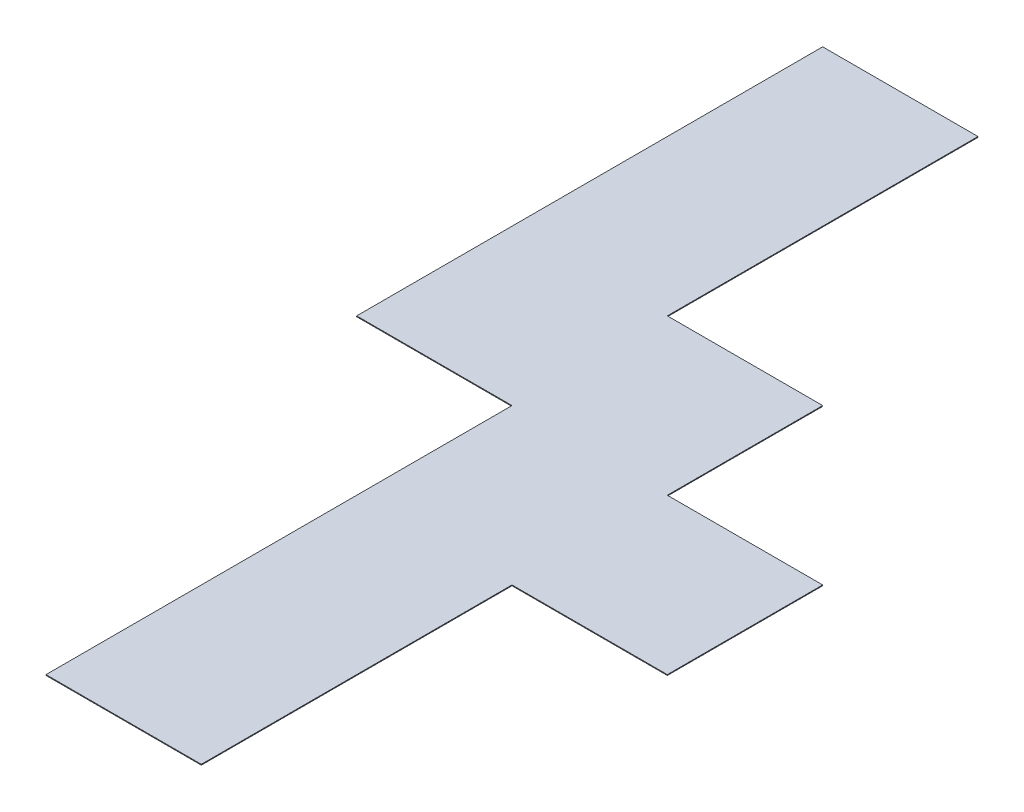
ISO-10303-21;
HEADER;
FILE_DESCRIPTION(('STEP AP214'),'2;1');
FILE_NAME('part.step','',(''),(''),'','','');
FILE_SCHEMA(('AUTOMOTIVE_DESIGN { 1 0 10303 214 1 1 1 1 }'));
ENDSEC;
DATA;
#1=APPLICATION_CONTEXT('core data for automotive mechanical design processes');
#2=APPLICATION_PROTOCOL_DEFINITION('international standard','automotive_design',2000,#1);
#3=PRODUCT_CONTEXT('',#1,'mechanical');
#4=PRODUCT('Part','Part','',(#3));
#5=PRODUCT_RELATED_PRODUCT_CATEGORY('part','',(#4));
#6=PRODUCT_DEFINITION_FORMATION('','',#4);
#7=PRODUCT_DEFINITION_CONTEXT('part definition',#1,'design');
#8=PRODUCT_DEFINITION('design','',#6,#7);
#9=PRODUCT_DEFINITION_SHAPE('','',#8);
#10=(LENGTH_UNIT() NAMED_UNIT(*) SI_UNIT(.MILLI.,.METRE.));
#11=(NAMED_UNIT(*) PLANE_ANGLE_UNIT() SI_UNIT($,.RADIAN.));
#12=(NAMED_UNIT(*) SI_UNIT($,.STERADIAN.) SOLID_ANGLE_UNIT());
#13=UNCERTAINTY_MEASURE_WITH_UNIT(LENGTH_MEASURE(1.E-05),#10,'distance_accuracy_value','');
#14=(GEOMETRIC_REPRESENTATION_CONTEXT(3) GLOBAL_UNCERTAINTY_ASSIGNED_CONTEXT((#13)) GLOBAL_UNIT_ASSIGNED_CONTEXT((#10,
#11,#12)) REPRESENTATION_CONTEXT('',''));
#15=CARTESIAN_POINT('',(0.,0.,0.));
#16=DIRECTION('',(0.,0.,1.));
#17=DIRECTION('',(1.,0.,0.));
#18=AXIS2_PLACEMENT_3D('',#15,#16,#17);
#19=CARTESIAN_POINT('',(2.97318429210987,2.601,1.67623709172676E-13));
#20=DIRECTION('',(1.,0.,0.));
#21=DIRECTION('',(0.,0.,-1.));
#22=AXIS2_PLACEMENT_3D('',#19,#20,#21);
#23=PLANE('',#22);
#24=DIRECTION('',(0.,0.,1.));
#25=VECTOR('',#24,1.);
#26=CARTESIAN_POINT('',(2.97318429210987,2.6,1.67623709172676E-13));
#27=LINE('',#26,#25);
#28=CARTESIAN_POINT('',(2.97318429210977,2.6,1.31907068929163));
#29=VERTEX_POINT('',#28);
#30=CARTESIAN_POINT('',(2.97318429210977,2.6,1.71907068929163));
#31=VERTEX_POINT('',#30);
#32=EDGE_CURVE('E11',#29,#31,#27,.T.);
#33=ORIENTED_EDGE('',*,*,#32,.F.);
#34=DIRECTION('',(0.,-1.,0.));
#35=VECTOR('',#34,1.);
#36=CARTESIAN_POINT('',(2.97318429210977,2.601,1.31907068929163));
#37=LINE('',#36,#35);
#38=CARTESIAN_POINT('',(2.97318429210977,2.601,1.31907068929163));
#39=VERTEX_POINT('',#38);
#40=EDGE_CURVE('E24',#39,#29,#37,.T.);
#41=ORIENTED_EDGE('',*,*,#40,.F.);
#42=DIRECTION('',(0.,0.,1.));
#43=VECTOR('',#42,1.);
#44=CARTESIAN_POINT('',(2.97318429210987,2.601,1.67623709172676E-13));
#45=LINE('',#44,#43);
#46=CARTESIAN_POINT('',(2.97318429210977,2.601,1.71907068929163));
#47=VERTEX_POINT('',#46);
#48=EDGE_CURVE('E206',#39,#47,#45,.T.);
#49=ORIENTED_EDGE('',*,*,#48,.T.);
#50=DIRECTION('',(0.,-1.,0.));
#51=VECTOR('',#50,1.);
#52=CARTESIAN_POINT('',(2.97318429210977,2.601,1.71907068929163));
#53=LINE('',#52,#51);
#54=EDGE_CURVE('E126',#47,#31,#53,.T.);
#55=ORIENTED_EDGE('',*,*,#54,.T.);
#56=EDGE_LOOP('',(#33,#41,#49,#55));
#57=FACE_BOUND('',#56,.T.);
#58=ADVANCED_FACE('F17',(#57),#23,.T.);
#59=CARTESIAN_POINT('',(0.,2.601,1.31907068929163));
#60=DIRECTION('',(0.,0.,-1.));
#61=DIRECTION('',(-1.,0.,0.));
#62=AXIS2_PLACEMENT_3D('',#59,#60,#61);
#63=PLANE('',#62);
#64=DIRECTION('',(1.,0.,0.));
#65=VECTOR('',#64,1.);
#66=CARTESIAN_POINT('',(0.,2.6,1.31907068929163));
#67=LINE('',#66,#65);
#68=CARTESIAN_POINT('',(3.17318429210943,2.6,1.31907068929163));
#69=VERTEX_POINT('',#68);
#70=EDGE_CURVE('E203',#29,#69,#67,.T.);
#71=ORIENTED_EDGE('',*,*,#70,.T.);
#72=DIRECTION('',(0.,-1.,0.));
#73=VECTOR('',#72,1.);
#74=CARTESIAN_POINT('',(3.17318429210943,2.601,1.31907068929163));
#75=LINE('',#74,#73);
#76=CARTESIAN_POINT('',(3.17318429210943,2.601,1.31907068929163));
#77=VERTEX_POINT('',#76);
#78=EDGE_CURVE('E200',#77,#69,#75,.T.);
#79=ORIENTED_EDGE('',*,*,#78,.F.);
#80=DIRECTION('',(1.,0.,0.));
#81=VECTOR('',#80,1.);
#82=CARTESIAN_POINT('',(0.,2.601,1.31907068929163));
#83=LINE('',#82,#81);
#84=EDGE_CURVE('E197',#39,#77,#83,.T.);
#85=ORIENTED_EDGE('',*,*,#84,.F.);
#86=ORIENTED_EDGE('',*,*,#40,.T.);
#87=EDGE_LOOP('',(#71,#79,#85,#86));
#88=FACE_BOUND('',#87,.T.);
#89=ADVANCED_FACE('F209',(#88),#63,.F.);
#90=CARTESIAN_POINT('',(3.17318429210951,2.601,1.78899411766505E-13));
#91=DIRECTION('',(1.,0.,0.));
#92=DIRECTION('',(0.,0.,-1.));
#93=AXIS2_PLACEMENT_3D('',#90,#91,#92);
#94=PLANE('',#93);
#95=DIRECTION('',(0.,0.,1.));
#96=VECTOR('',#95,1.);
#97=CARTESIAN_POINT('',(3.17318429210951,2.6,1.78899411766505E-13));
#98=LINE('',#97,#96);
#99=CARTESIAN_POINT('',(3.17318429210943,2.6,1.11907068929163));
#100=VERTEX_POINT('',#99);
#101=EDGE_CURVE('E194',#100,#69,#98,.T.);
#102=ORIENTED_EDGE('',*,*,#101,.F.);
#103=DIRECTION('',(0.,-1.,0.));
#104=VECTOR('',#103,1.);
#105=CARTESIAN_POINT('',(3.17318429210943,2.601,1.11907068929163));
#106=LINE('',#105,#104);
#107=CARTESIAN_POINT('',(3.17318429210943,2.601,1.11907068929163));
#108=VERTEX_POINT('',#107);
#109=EDGE_CURVE('E191',#108,#100,#106,.T.);
#110=ORIENTED_EDGE('',*,*,#109,.F.);
#111=DIRECTION('',(0.,0.,1.));
#112=VECTOR('',#111,1.);
#113=CARTESIAN_POINT('',(3.17318429210951,2.601,1.78899411766505E-13));
#114=LINE('',#113,#112);
#115=EDGE_CURVE('E188',#108,#77,#114,.T.);
#116=ORIENTED_EDGE('',*,*,#115,.T.);
#117=ORIENTED_EDGE('',*,*,#78,.T.);
#118=EDGE_LOOP('',(#102,#110,#116,#117));
#119=FACE_BOUND('',#118,.T.);
#120=ADVANCED_FACE('F212',(#119),#94,.T.);
#121=CARTESIAN_POINT('',(0.,2.601,1.11907068929163));
#122=DIRECTION('',(0.,0.,-1.));
#123=DIRECTION('',(-1.,0.,0.));
#124=AXIS2_PLACEMENT_3D('',#121,#122,#123);
#125=PLANE('',#124);
#126=DIRECTION('',(1.,0.,0.));
#127=VECTOR('',#126,1.);
#128=CARTESIAN_POINT('',(0.,2.6,1.11907068929163));
#129=LINE('',#128,#127);
#130=CARTESIAN_POINT('',(2.97318429210977,2.6,1.11907068929163));
#131=VERTEX_POINT('',#130);
#132=EDGE_CURVE('E185',#131,#100,#129,.T.);
#133=ORIENTED_EDGE('',*,*,#132,.F.);
#134=DIRECTION('',(0.,-1.,0.));
#135=VECTOR('',#134,1.);
#136=CARTESIAN_POINT('',(2.97318429210977,2.601,1.11907068929163));
#137=LINE('',#136,#135);
#138=CARTESIAN_POINT('',(2.97318429210977,2.601,1.11907068929163));
#139=VERTEX_POINT('',#138);
#140=EDGE_CURVE('E182',#139,#131,#137,.T.);
#141=ORIENTED_EDGE('',*,*,#140,.F.);
#142=DIRECTION('',(1.,0.,0.));
#143=VECTOR('',#142,1.);
#144=CARTESIAN_POINT('',(0.,2.601,1.11907068929163));
#145=LINE('',#144,#143);
#146=EDGE_CURVE('E179',#139,#108,#145,.T.);
#147=ORIENTED_EDGE('',*,*,#146,.T.);
#148=ORIENTED_EDGE('',*,*,#109,.T.);
#149=EDGE_LOOP('',(#133,#141,#147,#148));
#150=FACE_BOUND('',#149,.T.);
#151=ADVANCED_FACE('F215',(#150),#125,.T.);
#152=CARTESIAN_POINT('',(2.97318429210984,2.601,1.74070774910085E-13));
#153=DIRECTION('',(1.,0.,0.));
#154=DIRECTION('',(0.,0.,-1.));
#155=AXIS2_PLACEMENT_3D('',#152,#153,#154);
#156=PLANE('',#155);
#157=DIRECTION('',(0.,0.,1.));
#158=VECTOR('',#157,1.);
#159=CARTESIAN_POINT('',(2.97318429210984,2.6,1.74070774910085E-13));
#160=LINE('',#159,#158);
#161=CARTESIAN_POINT('',(2.97318429210979,2.6,0.919070689291635));
#162=VERTEX_POINT('',#161);
#163=EDGE_CURVE('E176',#162,#131,#160,.T.);
#164=ORIENTED_EDGE('',*,*,#163,.F.);
#165=DIRECTION('',(0.,-1.,0.));
#166=VECTOR('',#165,1.);
#167=CARTESIAN_POINT('',(2.97318429210979,2.601,0.919070689291635));
#168=LINE('',#167,#166);
#169=CARTESIAN_POINT('',(2.97318429210979,2.601,0.919070689291635));
#170=VERTEX_POINT('',#169);
#171=EDGE_CURVE('E173',#170,#162,#168,.T.);
#172=ORIENTED_EDGE('',*,*,#171,.F.);
#173=DIRECTION('',(0.,0.,1.));
#174=VECTOR('',#173,1.);
#175=CARTESIAN_POINT('',(2.97318429210984,2.601,1.74070774910085E-13));
#176=LINE('',#175,#174);
#177=EDGE_CURVE('E170',#170,#139,#176,.T.);
#178=ORIENTED_EDGE('',*,*,#177,.T.);
#179=ORIENTED_EDGE('',*,*,#140,.T.);
#180=EDGE_LOOP('',(#164,#172,#178,#179));
#181=FACE_BOUND('',#180,.T.);
#182=ADVANCED_FACE('F220',(#181),#156,.T.);
#183=CARTESIAN_POINT('',(0.,2.601,0.919070689291635));
#184=DIRECTION('',(0.,0.,-1.));
#185=DIRECTION('',(-1.,0.,0.));
#186=AXIS2_PLACEMENT_3D('',#183,#184,#185);
#187=PLANE('',#186);
#188=DIRECTION('',(1.,0.,0.));
#189=VECTOR('',#188,1.);
#190=CARTESIAN_POINT('',(0.,2.6,0.919070689291635));
#191=LINE('',#190,#189);
#192=CARTESIAN_POINT('',(2.77318429211011,2.6,0.919070689291635));
#193=VERTEX_POINT('',#192);
#194=EDGE_CURVE('E167',#193,#162,#191,.T.);
#195=ORIENTED_EDGE('',*,*,#194,.F.);
#196=DIRECTION('',(0.,-1.,0.));
#197=VECTOR('',#196,1.);
#198=CARTESIAN_POINT('',(2.77318429211011,2.601,0.919070689291635));
#199=LINE('',#198,#197);
#200=CARTESIAN_POINT('',(2.77318429211011,2.601,0.919070689291635));
#201=VERTEX_POINT('',#200);
#202=EDGE_CURVE('E164',#201,#193,#199,.T.);
#203=ORIENTED_EDGE('',*,*,#202,.F.);
#204=DIRECTION('',(1.,0.,0.));
#205=VECTOR('',#204,1.);
#206=CARTESIAN_POINT('',(0.,2.601,0.919070689291635));
#207=LINE('',#206,#205);
#208=EDGE_CURVE('E161',#201,#170,#207,.T.);
#209=ORIENTED_EDGE('',*,*,#208,.T.);
#210=ORIENTED_EDGE('',*,*,#171,.T.);
#211=EDGE_LOOP('',(#195,#203,#209,#210));
#212=FACE_BOUND('',#211,.T.);
#213=ADVANCED_FACE('F222',(#212),#187,.T.);
#214=CARTESIAN_POINT('',(2.77318429211017,2.601,1.62361391447261E-13));
#215=DIRECTION('',(1.,0.,0.));
#216=DIRECTION('',(0.,0.,-1.));
#217=AXIS2_PLACEMENT_3D('',#214,#215,#216);
#218=PLANE('',#217);
#219=DIRECTION('',(0.,0.,1.));
#220=VECTOR('',#219,1.);
#221=CARTESIAN_POINT('',(2.77318429211017,2.6,1.62361391447261E-13));
#222=LINE('',#221,#220);
#223=CARTESIAN_POINT('',(2.77318429211013,2.6,0.519070689291638));
#224=VERTEX_POINT('',#223);
#225=EDGE_CURVE('E158',#224,#193,#222,.T.);
#226=ORIENTED_EDGE('',*,*,#225,.F.);
#227=DIRECTION('',(0.,-1.,0.));
#228=VECTOR('',#227,1.);
#229=CARTESIAN_POINT('',(2.77318429211013,2.601,0.519070689291638));
#230=LINE('',#229,#228);
#231=CARTESIAN_POINT('',(2.77318429211013,2.601,0.519070689291638));
#232=VERTEX_POINT('',#231);
#233=EDGE_CURVE('E155',#232,#224,#230,.T.);
#234=ORIENTED_EDGE('',*,*,#233,.F.);
#235=DIRECTION('',(0.,0.,1.));
#236=VECTOR('',#235,1.);
#237=CARTESIAN_POINT('',(2.77318429211017,2.601,1.62361391447261E-13));
#238=LINE('',#237,#236);
#239=EDGE_CURVE('E152',#232,#201,#238,.T.);
#240=ORIENTED_EDGE('',*,*,#239,.T.);
#241=ORIENTED_EDGE('',*,*,#202,.T.);
#242=EDGE_LOOP('',(#226,#234,#240,#241));
#243=FACE_BOUND('',#242,.T.);
#244=ADVANCED_FACE('F225',(#243),#218,.T.);
#245=CARTESIAN_POINT('',(0.,2.601,0.519070689291638));
#246=DIRECTION('',(0.,0.,-1.));
#247=DIRECTION('',(-1.,0.,0.));
#248=AXIS2_PLACEMENT_3D('',#245,#246,#247);
#249=PLANE('',#248);
#250=DIRECTION('',(1.,0.,0.));
#251=VECTOR('',#250,1.);
#252=CARTESIAN_POINT('',(0.,2.6,0.519070689291638));
#253=LINE('',#252,#251);
#254=CARTESIAN_POINT('',(2.57318429211046,2.6,0.519070689291638));
#255=VERTEX_POINT('',#254);
#256=EDGE_CURVE('E149',#255,#224,#253,.T.);
#257=ORIENTED_EDGE('',*,*,#256,.F.);
#258=DIRECTION('',(0.,-1.,0.));
#259=VECTOR('',#258,1.);
#260=CARTESIAN_POINT('',(2.57318429211046,2.601,0.519070689291638));
#261=LINE('',#260,#259);
#262=CARTESIAN_POINT('',(2.57318429211046,2.601,0.519070689291638));
#263=VERTEX_POINT('',#262);
#264=EDGE_CURVE('E146',#263,#255,#261,.T.);
#265=ORIENTED_EDGE('',*,*,#264,.F.);
#266=DIRECTION('',(1.,0.,0.));
#267=VECTOR('',#266,1.);
#268=CARTESIAN_POINT('',(0.,2.601,0.519070689291638));
#269=LINE('',#268,#267);
#270=EDGE_CURVE('E143',#263,#232,#269,.T.);
#271=ORIENTED_EDGE('',*,*,#270,.T.);
#272=ORIENTED_EDGE('',*,*,#233,.T.);
#273=EDGE_LOOP('',(#257,#265,#271,#272));
#274=FACE_BOUND('',#273,.T.);
#275=ADVANCED_FACE('F228',(#274),#249,.T.);
#276=CARTESIAN_POINT('',(2.57318429211047,2.601,0.));
#277=DIRECTION('',(1.,0.,0.));
#278=DIRECTION('',(0.,0.,-1.));
#279=AXIS2_PLACEMENT_3D('',#276,#277,#278);
#280=PLANE('',#279);
#281=DIRECTION('',(0.,0.,1.));
#282=VECTOR('',#281,1.);
#283=CARTESIAN_POINT('',(2.57318429211047,2.6,0.));
#284=LINE('',#283,#282);
#285=CARTESIAN_POINT('',(2.57318429211047,2.6,1.11907068929163));
#286=VERTEX_POINT('',#285);
#287=EDGE_CURVE('E141',#255,#286,#284,.T.);
#288=ORIENTED_EDGE('',*,*,#287,.T.);
#289=DIRECTION('',(0.,-1.,0.));
#290=VECTOR('',#289,1.);
#291=CARTESIAN_POINT('',(2.57318429211047,2.601,1.11907068929163));
#292=LINE('',#291,#290);
#293=CARTESIAN_POINT('',(2.57318429211047,2.601,1.11907068929163));
#294=VERTEX_POINT('',#293);
#295=EDGE_CURVE('E138',#294,#286,#292,.T.);
#296=ORIENTED_EDGE('',*,*,#295,.F.);
#297=DIRECTION('',(0.,0.,1.));
#298=VECTOR('',#297,1.);
#299=CARTESIAN_POINT('',(2.57318429211047,2.601,0.));
#300=LINE('',#299,#298);
#301=EDGE_CURVE('E136',#263,#294,#300,.T.);
#302=ORIENTED_EDGE('',*,*,#301,.F.);
#303=ORIENTED_EDGE('',*,*,#264,.T.);
#304=EDGE_LOOP('',(#288,#296,#302,#303));
#305=FACE_BOUND('',#304,.T.);
#306=ADVANCED_FACE('F232',(#305),#280,.F.);
#307=CARTESIAN_POINT('',(0.,2.601,1.11907068929163));
#308=DIRECTION('',(0.,0.,-1.));
#309=DIRECTION('',(-1.,0.,0.));
#310=AXIS2_PLACEMENT_3D('',#307,#308,#309);
#311=PLANE('',#310);
#312=DIRECTION('',(1.,0.,0.));
#313=VECTOR('',#312,1.);
#314=CARTESIAN_POINT('',(0.,2.6,1.11907068929163));
#315=LINE('',#314,#313);
#316=CARTESIAN_POINT('',(2.77318429211011,2.6,1.11907068929163));
#317=VERTEX_POINT('',#316);
#318=EDGE_CURVE('E134',#286,#317,#315,.T.);
#319=ORIENTED_EDGE('',*,*,#318,.T.);
#320=DIRECTION('',(0.,-1.,0.));
#321=VECTOR('',#320,1.);
#322=CARTESIAN_POINT('',(2.77318429211011,2.601,1.11907068929163));
#323=LINE('',#322,#321);
#324=CARTESIAN_POINT('',(2.77318429211011,2.601,1.11907068929163));
#325=VERTEX_POINT('',#324);
#326=EDGE_CURVE('E132',#325,#317,#323,.T.);
#327=ORIENTED_EDGE('',*,*,#326,.F.);
#328=DIRECTION('',(1.,0.,0.));
#329=VECTOR('',#328,1.);
#330=CARTESIAN_POINT('',(0.,2.601,1.11907068929163));
#331=LINE('',#330,#329);
#332=EDGE_CURVE('E121',#294,#325,#331,.T.);
#333=ORIENTED_EDGE('',*,*,#332,.F.);
#334=ORIENTED_EDGE('',*,*,#295,.T.);
#335=EDGE_LOOP('',(#319,#327,#333,#334));
#336=FACE_BOUND('',#335,.T.);
#337=ADVANCED_FACE('F235',(#336),#311,.F.);
#338=CARTESIAN_POINT('',(2.77318429211013,2.601,0.));
#339=DIRECTION('',(1.,0.,0.));
#340=DIRECTION('',(0.,0.,-1.));
#341=AXIS2_PLACEMENT_3D('',#338,#339,#340);
#342=PLANE('',#341);
#343=DIRECTION('',(0.,0.,1.));
#344=VECTOR('',#343,1.);
#345=CARTESIAN_POINT('',(2.77318429211013,2.6,0.));
#346=LINE('',#345,#344);
#347=CARTESIAN_POINT('',(2.77318429211013,2.6,1.71907068929163));
#348=VERTEX_POINT('',#347);
#349=EDGE_CURVE('E108',#317,#348,#346,.T.);
#350=ORIENTED_EDGE('',*,*,#349,.T.);
#351=DIRECTION('',(0.,-1.,0.));
#352=VECTOR('',#351,1.);
#353=CARTESIAN_POINT('',(2.77318429211013,2.601,1.71907068929163));
#354=LINE('',#353,#352);
#355=CARTESIAN_POINT('',(2.77318429211013,2.601,1.71907068929163));
#356=VERTEX_POINT('',#355);
#357=EDGE_CURVE('E102',#356,#348,#354,.T.);
#358=ORIENTED_EDGE('',*,*,#357,.F.);
#359=DIRECTION('',(0.,0.,1.));
#360=VECTOR('',#359,1.);
#361=CARTESIAN_POINT('',(2.77318429211013,2.601,0.));
#362=LINE('',#361,#360);
#363=EDGE_CURVE('E106',#325,#356,#362,.T.);
#364=ORIENTED_EDGE('',*,*,#363,.F.);
#365=ORIENTED_EDGE('',*,*,#326,.T.);
#366=EDGE_LOOP('',(#350,#358,#364,#365));
#367=FACE_BOUND('',#366,.T.);
#368=ADVANCED_FACE('F104',(#367),#342,.F.);
#369=CARTESIAN_POINT('',(0.,2.601,1.71907068929163));
#370=DIRECTION('',(0.,0.,-1.));
#371=DIRECTION('',(-1.,0.,0.));
#372=AXIS2_PLACEMENT_3D('',#369,#370,#371);
#373=PLANE('',#372);
#374=DIRECTION('',(1.,0.,0.));
#375=VECTOR('',#374,1.);
#376=CARTESIAN_POINT('',(0.,2.6,1.71907068929163));
#377=LINE('',#376,#375);
#378=EDGE_CURVE('E122',#348,#31,#377,.T.);
#379=ORIENTED_EDGE('',*,*,#378,.T.);
#380=ORIENTED_EDGE('',*,*,#54,.F.);
#381=DIRECTION('',(1.,0.,0.));
#382=VECTOR('',#381,1.);
#383=CARTESIAN_POINT('',(0.,2.601,1.71907068929163));
#384=LINE('',#383,#382);
#385=EDGE_CURVE('E118',#356,#47,#384,.T.);
#386=ORIENTED_EDGE('',*,*,#385,.F.);
#387=ORIENTED_EDGE('',*,*,#357,.T.);
#388=EDGE_LOOP('',(#379,#380,#386,#387));
#389=FACE_BOUND('',#388,.T.);
#390=ADVANCED_FACE('F125',(#389),#373,.F.);
#391=CARTESIAN_POINT('',(0.,2.601,0.));
#392=DIRECTION('',(0.,1.,0.));
#393=DIRECTION('',(0.,0.,1.));
#394=AXIS2_PLACEMENT_3D('',#391,#392,#393);
#395=PLANE('',#394);
#396=ORIENTED_EDGE('',*,*,#48,.F.);
#397=ORIENTED_EDGE('',*,*,#84,.T.);
#398=ORIENTED_EDGE('',*,*,#115,.F.);
#399=ORIENTED_EDGE('',*,*,#146,.F.);
#400=ORIENTED_EDGE('',*,*,#177,.F.);
#401=ORIENTED_EDGE('',*,*,#208,.F.);
#402=ORIENTED_EDGE('',*,*,#239,.F.);
#403=ORIENTED_EDGE('',*,*,#270,.F.);
#404=ORIENTED_EDGE('',*,*,#301,.T.);
#405=ORIENTED_EDGE('',*,*,#332,.T.);
#406=ORIENTED_EDGE('',*,*,#363,.T.);
#407=ORIENTED_EDGE('',*,*,#385,.T.);
#408=EDGE_LOOP('',(#396,#397,#398,#399,#400,#401,#402,#403,#404,#405,#406,#407));
#409=FACE_BOUND('',#408,.T.);
#410=ADVANCED_FACE('F117',(#409),#395,.T.);
#411=CARTESIAN_POINT('',(0.,2.6,0.));
#412=DIRECTION('',(0.,1.,0.));
#413=DIRECTION('',(0.,0.,1.));
#414=AXIS2_PLACEMENT_3D('',#411,#412,#413);
#415=PLANE('',#414);
#416=ORIENTED_EDGE('',*,*,#32,.T.);
#417=ORIENTED_EDGE('',*,*,#378,.F.);
#418=ORIENTED_EDGE('',*,*,#349,.F.);
#419=ORIENTED_EDGE('',*,*,#318,.F.);
#420=ORIENTED_EDGE('',*,*,#287,.F.);
#421=ORIENTED_EDGE('',*,*,#256,.T.);
#422=ORIENTED_EDGE('',*,*,#225,.T.);
#423=ORIENTED_EDGE('',*,*,#194,.T.);
#424=ORIENTED_EDGE('',*,*,#163,.T.);
#425=ORIENTED_EDGE('',*,*,#132,.T.);
#426=ORIENTED_EDGE('',*,*,#101,.T.);
#427=ORIENTED_EDGE('',*,*,#70,.F.);
#428=EDGE_LOOP('',(#416,#417,#418,#419,#420,#421,#422,#423,#424,#425,#426,#427));
#429=FACE_BOUND('',#428,.T.);
#430=ADVANCED_FACE('F210',(#429),#415,.F.);
#431=CLOSED_SHELL('',(#58,#89,#120,#151,#182,#213,#244,#275,#306,#337,#368,#390,#410,#430));
#432=MANIFOLD_SOLID_BREP('B1',#431);
#433=ADVANCED_BREP_SHAPE_REPRESENTATION('',(#18,#432),#14);
#434=SHAPE_DEFINITION_REPRESENTATION(#9,#433);
ENDSEC;
END-ISO-10303-21;
